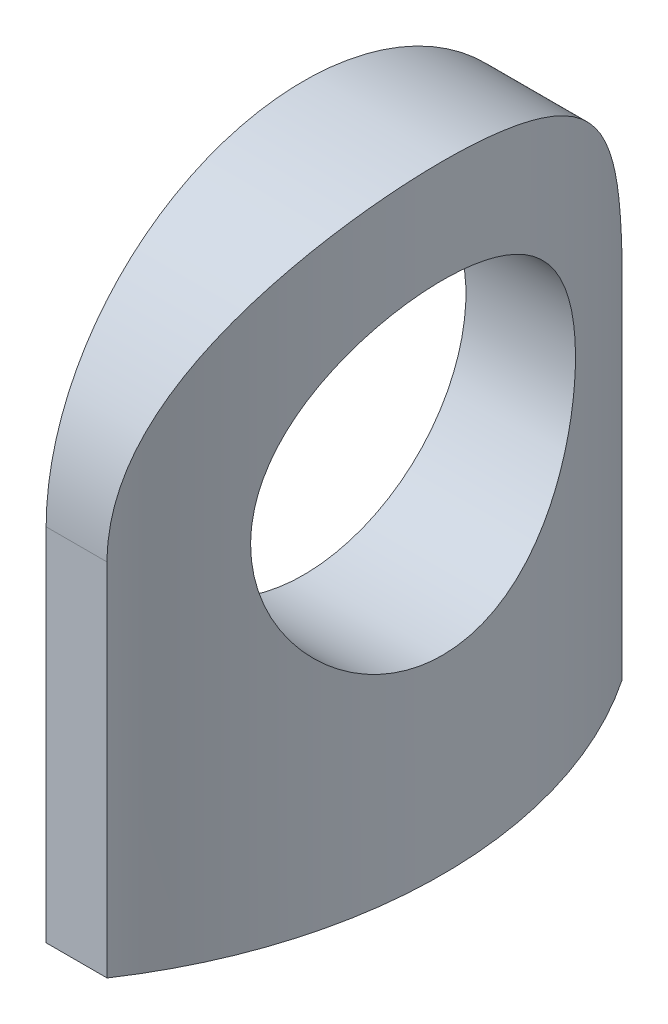
ISO-10303-21;
HEADER;
FILE_DESCRIPTION(('STEP AP214'),'2;1');
FILE_NAME('part.step','',(''),(''),'','','');
FILE_SCHEMA(('AUTOMOTIVE_DESIGN { 1 0 10303 214 1 1 1 1 }'));
ENDSEC;
DATA;
#1=APPLICATION_CONTEXT('core data for automotive mechanical design processes');
#2=APPLICATION_PROTOCOL_DEFINITION('international standard','automotive_design',2000,#1);
#3=PRODUCT_CONTEXT('',#1,'mechanical');
#4=PRODUCT('Part','Part','',(#3));
#5=PRODUCT_RELATED_PRODUCT_CATEGORY('part','',(#4));
#6=PRODUCT_DEFINITION_FORMATION('','',#4);
#7=PRODUCT_DEFINITION_CONTEXT('part definition',#1,'design');
#8=PRODUCT_DEFINITION('design','',#6,#7);
#9=PRODUCT_DEFINITION_SHAPE('','',#8);
#10=(LENGTH_UNIT() NAMED_UNIT(*) SI_UNIT(.MILLI.,.METRE.));
#11=(NAMED_UNIT(*) PLANE_ANGLE_UNIT() SI_UNIT($,.RADIAN.));
#12=(NAMED_UNIT(*) SI_UNIT($,.STERADIAN.) SOLID_ANGLE_UNIT());
#13=UNCERTAINTY_MEASURE_WITH_UNIT(LENGTH_MEASURE(1.E-05),#10,'distance_accuracy_value','');
#14=(GEOMETRIC_REPRESENTATION_CONTEXT(3) GLOBAL_UNCERTAINTY_ASSIGNED_CONTEXT((#13)) GLOBAL_UNIT_ASSIGNED_CONTEXT((#10,
#11,#12)) REPRESENTATION_CONTEXT('',''));
#15=CARTESIAN_POINT('',(0.,0.,0.));
#16=DIRECTION('',(0.,0.,1.));
#17=DIRECTION('',(1.,0.,0.));
#18=AXIS2_PLACEMENT_3D('',#15,#16,#17);
#19=CARTESIAN_POINT('',(20.0025,12.7,-31.75));
#20=DIRECTION('',(1.,0.,0.));
#21=DIRECTION('',(0.,1.,0.));
#22=AXIS2_PLACEMENT_3D('',#19,#20,#21);
#23=PLANE('',#22);
#24=DIRECTION('',(0.,1.,0.));
#25=VECTOR('',#24,1.);
#26=CARTESIAN_POINT('',(20.0025,31.75,-15.875));
#27=LINE('',#26,#25);
#28=CARTESIAN_POINT('',(20.0025,25.4,-15.875));
#29=VERTEX_POINT('',#28);
#30=CARTESIAN_POINT('',(20.0025001,47.625,-15.875));
#31=VERTEX_POINT('',#30);
#32=EDGE_CURVE('E60',#29,#31,#27,.T.);
#33=ORIENTED_EDGE('',*,*,#32,.F.);
#34=DIRECTION('',(0.,0.,-1.));
#35=VECTOR('',#34,1.);
#36=CARTESIAN_POINT('',(20.0025,25.4,0.));
#37=LINE('',#36,#35);
#38=CARTESIAN_POINT('',(20.0025,25.4,15.875));
#39=VERTEX_POINT('',#38);
#40=EDGE_CURVE('E11',#39,#29,#37,.T.);
#41=ORIENTED_EDGE('',*,*,#40,.F.);
#42=DIRECTION('',(0.,1.,0.));
#43=VECTOR('',#42,1.);
#44=CARTESIAN_POINT('',(20.0025,31.75,15.875));
#45=LINE('',#44,#43);
#46=CARTESIAN_POINT('',(20.0025,47.6250000015875,15.875));
#47=VERTEX_POINT('',#46);
#48=EDGE_CURVE('E88',#39,#47,#45,.T.);
#49=ORIENTED_EDGE('',*,*,#48,.T.);
#50=CARTESIAN_POINT('',(20.0025,47.625,0.));
#51=DIRECTION('',(1.,0.,0.));
#52=DIRECTION('',(0.,0.,-1.));
#53=AXIS2_PLACEMENT_3D('',#50,#51,#52);
#54=CIRCLE('',#53,15.875);
#55=EDGE_CURVE('E154',#31,#47,#54,.T.);
#56=ORIENTED_EDGE('',*,*,#55,.F.);
#57=EDGE_LOOP('',(#33,#41,#49,#56));
#58=FACE_BOUND('',#57,.T.);
#59=CARTESIAN_POINT('',(20.0025,47.1297,0.));
#60=DIRECTION('',(-1.,0.,0.));
#61=DIRECTION('',(0.,0.,1.));
#62=AXIS2_PLACEMENT_3D('',#59,#60,#61);
#63=CIRCLE('',#62,10.0203);
#64=CARTESIAN_POINT('',(20.0025,47.1297,10.0203));
#65=VERTEX_POINT('',#64);
#66=EDGE_CURVE('E184',#65,#65,#63,.T.);
#67=ORIENTED_EDGE('',*,*,#66,.F.);
#68=EDGE_LOOP('',(#67));
#69=FACE_BOUND('',#68,.T.);
#70=ADVANCED_FACE('F43',(#58,#69),#23,.F.);
#71=CARTESIAN_POINT('',(-103.07574,47.625,0.));
#72=DIRECTION('',(1.,0.,0.));
#73=DIRECTION('',(0.,1.,0.));
#74=AXIS2_PLACEMENT_3D('',#71,#72,#73);
#75=CYLINDRICAL_SURFACE('',#74,15.875);
#76=CARTESIAN_POINT('',(28.575,63.5,0.));
#77=CARTESIAN_POINT('',(28.575002626647,63.5000013550789,0.206608866897238));
#78=CARTESIAN_POINT('',(28.5727584775999,63.4959656930392,0.413189463176419));
#79=CARTESIAN_POINT('',(28.5638067234789,63.4798452969933,0.82592999213907));
#80=CARTESIAN_POINT('',(28.5570993263651,63.4677609380075,1.03208994397311));
#81=CARTESIAN_POINT('',(28.5303393107039,63.4194937395245,1.64913971318309));
#82=CARTESIAN_POINT('',(28.5036487851183,63.3712967049631,2.0588834252847));
#83=CARTESIAN_POINT('',(28.4334271695705,63.2438211581274,2.86979641598518));
#84=CARTESIAN_POINT('',(28.3899830263132,63.164703089536,3.27099886046867));
#85=CARTESIAN_POINT('',(28.2873215678301,62.9763450644619,4.06423419296298));
#86=CARTESIAN_POINT('',(28.2281030880267,62.8671028839748,4.45626640163406));
#87=CARTESIAN_POINT('',(28.0954078741234,62.6199255274337,5.22797921454727));
#88=CARTESIAN_POINT('',(28.0219533295744,62.4820349814026,5.60767798103191));
#89=CARTESIAN_POINT('',(27.8623845092588,62.1788340244862,6.35322851986153));
#90=CARTESIAN_POINT('',(27.7762690216698,62.0135209887056,6.71907896251629));
#91=CARTESIAN_POINT('',(27.5931552641565,61.6567736219933,7.43540281562206));
#92=CARTESIAN_POINT('',(27.4961468230338,61.4653148410445,7.78586142221105));
#93=CARTESIAN_POINT('',(27.2933159070587,61.0578446065158,8.46951534210945));
#94=CARTESIAN_POINT('',(27.1874930597863,60.841832115369,8.80270992502571));
#95=CARTESIAN_POINT('',(26.9616260639239,60.3709738186348,9.4728461547712));
#96=CARTESIAN_POINT('',(26.8411043976972,60.1144787151367,9.80846822096996));
#97=CARTESIAN_POINT('',(26.5950375004005,59.5764963260797,10.4572969776648));
#98=CARTESIAN_POINT('',(26.4694901946195,59.294998659145,10.7704942587071));
#99=CARTESIAN_POINT('',(26.216100128547,58.7082742425436,11.3733778590713));
#100=CARTESIAN_POINT('',(26.0882555052157,58.4030274973727,11.6630439376294));
#101=CARTESIAN_POINT('',(25.8332967143976,57.7703466305158,12.2173856043466));
#102=CARTESIAN_POINT('',(25.7061825850494,57.4429113615954,12.4820598986357));
#103=CARTESIAN_POINT('',(25.4429117185561,56.7324913790674,13.010948345499));
#104=CARTESIAN_POINT('',(25.3071580097955,56.3472491829896,13.2723526138569));
#105=CARTESIAN_POINT('',(25.1102341513862,55.751742884574,13.6391368140879));
#106=CARTESIAN_POINT('',(25.0457058112787,55.5502836535871,13.7571861816917));
#107=CARTESIAN_POINT('',(24.9193987408874,55.1415968316861,13.9846743739953));
#108=CARTESIAN_POINT('',(24.8576212189792,54.934366769487,14.0941094305071));
#109=CARTESIAN_POINT('',(24.6776342013071,54.3056818680676,14.4084421668155));
#110=CARTESIAN_POINT('',(24.564375473467,53.8760554446508,14.6000933717377));
#111=CARTESIAN_POINT('',(24.3557048417045,52.9978104381176,14.9456041491806));
#112=CARTESIAN_POINT('',(24.260287206609,52.5491980109445,15.099475862765));
#113=CARTESIAN_POINT('',(24.1098480437756,51.7351477981218,15.3382262428381));
#114=CARTESIAN_POINT('',(24.0505533976883,51.3727537879511,15.4308300862995));
#115=CARTESIAN_POINT('',(23.9473529191105,50.6403084339474,15.5905091724757));
#116=CARTESIAN_POINT('',(23.9034427307928,50.2702592890013,15.6575916415625));
#117=CARTESIAN_POINT('',(23.8322591089723,49.5225628878812,15.7657320284054));
#118=CARTESIAN_POINT('',(23.8050814477847,49.1448844410849,15.8066401830387));
#119=CARTESIAN_POINT('',(23.7778006541761,48.576200967285,15.8476197917743));
#120=CARTESIAN_POINT('',(23.7709546288817,48.3861858945141,15.8578825825827));
#121=CARTESIAN_POINT('',(23.7618141305394,48.005788681296,15.8715736697468));
#122=CARTESIAN_POINT('',(23.7595199426243,47.8154065186016,15.8750015379543));
#123=CARTESIAN_POINT('',(23.7595244060145,47.6250000512827,15.875));
#124=B_SPLINE_CURVE_WITH_KNOTS('',3,(#76,#77,#78,#79,#80,#81,#82,#83,#84,#85,#86,#87,#88,#89,
#90,#91,#92,#93,#94,#95,#96,#97,#98,#99,#100,#101,#102,#103,#104,#105,#106,#107,#108,#109,#110,
#111,#112,#113,#114,#115,#116,#117,#118,#119,#120,#121,#122,#123),.UNSPECIFIED.,.F.,.F.,(4,2,2,
2,2,2,2,2,2,2,2,2,2,2,2,2,2,2,2,2,2,2,2,4),(0.,0.619718984513591,1.23940909591682,
2.47794043424568,3.710128803065,4.94240816631178,6.17278202027725,7.40327371430886,
8.63492407620783,9.86662650335497,11.1830765538908,12.5000757892257,13.8181961259973,
15.1363846668763,16.589252860282,17.315801887972,18.0426669864992,19.4920987772133,
20.9410641575985,22.0760207851448,23.2106558103473,24.3517262193265,24.9228172310223,
25.4939440154544),.UNSPECIFIED.);
#125=CARTESIAN_POINT('',(28.575,63.4999999166364,0.));
#126=VERTEX_POINT('',#125);
#127=CARTESIAN_POINT('',(23.7595244073544,47.6250000510915,15.87499999802));
#128=VERTEX_POINT('',#127);
#129=EDGE_CURVE('E108',#126,#128,#124,.T.);
#130=ORIENTED_EDGE('',*,*,#129,.F.);
#131=CARTESIAN_POINT('',(28.575,63.5,0.));
#132=CARTESIAN_POINT('',(28.5735892823362,63.4999998247561,-0.128769740949089));
#133=CARTESIAN_POINT('',(28.5718501579519,63.4984330671729,-0.257527909497629));
#134=CARTESIAN_POINT('',(28.5677225545907,63.4924434755048,-0.503644604278612));
#135=CARTESIAN_POINT('',(28.5654045556859,63.4882836799331,-0.621010736797138));
#136=CARTESIAN_POINT('',(28.5579864740723,63.4734763402549,-0.939033358133707));
#137=CARTESIAN_POINT('',(28.5520801904402,63.4603188003046,-1.13956791719391));
#138=CARTESIAN_POINT('',(28.5399020058571,63.4363293595198,-1.42283586574148));
#139=CARTESIAN_POINT('',(28.5358599468876,63.4286302410845,-1.50594039538025));
#140=CARTESIAN_POINT('',(28.5256238783954,63.4098394374103,-1.69273422859841));
#141=CARTESIAN_POINT('',(28.5191444804798,63.398380909255,-1.79637094013196));
#142=CARTESIAN_POINT('',(28.497974612956,63.3606556362435,-2.10933061135925));
#143=CARTESIAN_POINT('',(28.4816716012573,63.3312429041902,-2.31817469142547));
#144=CARTESIAN_POINT('',(28.444358141253,63.263645560175,-2.73756257981999));
#145=CARTESIAN_POINT('',(28.4232746589601,63.2253245944351,-2.94807782466833));
#146=CARTESIAN_POINT('',(28.377808725468,63.1423080967939,-3.35712128541731));
#147=CARTESIAN_POINT('',(28.3536267975431,63.0979947391165,-3.55574948320132));
#148=CARTESIAN_POINT('',(28.3008366123261,63.0010497326542,-3.9541751710802));
#149=CARTESIAN_POINT('',(28.2721573042778,62.9482842024121,-4.15393066708671));
#150=CARTESIAN_POINT('',(28.2104241852366,62.8341658869697,-4.55422671762106));
#151=CARTESIAN_POINT('',(28.1773014811763,62.7726767394628,-4.75471774094067));
#152=CARTESIAN_POINT('',(28.1066630754937,62.6408583641048,-5.15606750035691));
#153=CARTESIAN_POINT('',(28.0690794731443,62.5703908511809,-5.35686883589486));
#154=CARTESIAN_POINT('',(27.9895330334089,62.420376373534,-5.75840350426275));
#155=CARTESIAN_POINT('',(27.9475039520765,62.3406896859855,-5.95907152521705));
#156=CARTESIAN_POINT('',(27.8641375086061,62.1817778826129,-6.33668363309105));
#157=CARTESIAN_POINT('',(27.823142259833,62.1032854035055,-6.51401243645553));
#158=CARTESIAN_POINT('',(27.7369341615497,61.9371694120216,-6.87151185710941));
#159=CARTESIAN_POINT('',(27.6916223360769,61.8493181589873,-7.05155280412374));
#160=CARTESIAN_POINT('',(27.5967883244044,61.6639590194373,-7.41391339810433));
#161=CARTESIAN_POINT('',(27.5471741425547,61.566220294531,-7.59609084595175));
#162=CARTESIAN_POINT('',(27.4437137823625,61.3605790005531,-7.96210090477917));
#163=CARTESIAN_POINT('',(27.3897809814159,61.2524434819795,-8.1457780760082));
#164=CARTESIAN_POINT('',(27.2777272578745,61.0255078792624,-8.51412571480991));
#165=CARTESIAN_POINT('',(27.2195267854333,60.9064732022656,-8.69862759851202));
#166=CARTESIAN_POINT('',(27.1142804823296,60.6893700103038,-9.02033300795738));
#167=CARTESIAN_POINT('',(27.0677363090891,60.5927511545684,-9.15868284067226));
#168=CARTESIAN_POINT('',(26.9684166054976,60.3847705062651,-9.44662433764498));
#169=CARTESIAN_POINT('',(26.9155079950026,60.2729386680588,-9.59583102004522));
#170=CARTESIAN_POINT('',(26.8034626012445,60.0332079979239,-9.90422898455003));
#171=CARTESIAN_POINT('',(26.7442189845546,59.9048021719421,-10.0629873213314));
#172=CARTESIAN_POINT('',(26.6195087101026,59.6305453587293,-10.3890228119711));
#173=CARTESIAN_POINT('',(26.5539546598758,59.4841553596099,-10.5558134995153));
#174=CARTESIAN_POINT('',(26.4164568094598,59.1725766163785,-10.8961730159494));
#175=CARTESIAN_POINT('',(26.3444263531233,59.0068265867712,-11.069192673241));
#176=CARTESIAN_POINT('',(26.1803143039057,58.6214071693342,-11.4537162352839));
#177=CARTESIAN_POINT('',(26.0881307697202,58.3993779288473,-11.6628207265424));
#178=CARTESIAN_POINT('',(25.9194791662034,57.9814563000252,-12.0342870397028));
#179=CARTESIAN_POINT('',(25.8429461013968,57.7873548103426,-12.1986406313676));
#180=CARTESIAN_POINT('',(25.7053862325346,57.4308972501105,-12.4860505521845));
#181=CARTESIAN_POINT('',(25.6443105297677,57.2699288932854,-12.6108066885494));
#182=CARTESIAN_POINT('',(25.5376582765414,56.9839241251194,-12.8237886812761));
#183=CARTESIAN_POINT('',(25.4920105228912,56.8599248051999,-12.9133732877126));
#184=CARTESIAN_POINT('',(25.4164320814337,56.6508078964629,-13.0598959600628));
#185=CARTESIAN_POINT('',(25.3863108761125,56.5664375717356,-13.1178055302696));
#186=CARTESIAN_POINT('',(25.2902140583383,56.2926694091187,-13.3018358947352));
#187=CARTESIAN_POINT('',(25.2253646603412,56.1008117457831,-13.4249115101363));
#188=CARTESIAN_POINT('',(25.1008497643881,55.7215314434107,-13.6568180237276));
#189=CARTESIAN_POINT('',(25.0410891851613,55.5343881537584,-13.7660559841435));
#190=CARTESIAN_POINT('',(24.9271076012895,55.1654746820767,-13.9713623924302));
#191=CARTESIAN_POINT('',(24.8727618331041,54.9839618618573,-14.0678236206212));
#192=CARTESIAN_POINT('',(24.7695197294551,54.6272439275388,-14.248574552264));
#193=CARTESIAN_POINT('',(24.7204894197895,54.4522704290596,-14.3332447449764));
#194=CARTESIAN_POINT('',(24.6279822587879,54.109407862052,-14.4914297483948));
#195=CARTESIAN_POINT('',(24.5843488508659,53.941729296842,-14.5653094584836));
#196=CARTESIAN_POINT('',(24.491180010804,53.5692481416681,-14.7217575996833));
#197=CARTESIAN_POINT('',(24.4422269091398,53.3637731194981,-14.8030771728745));
#198=CARTESIAN_POINT('',(24.3496453146162,52.9551849286634,-14.9549589399451));
#199=CARTESIAN_POINT('',(24.3058996065091,52.7521924130484,-15.0257744630886));
#200=CARTESIAN_POINT('',(24.2238015554129,52.3491400053287,-15.1572306084439));
#201=CARTESIAN_POINT('',(24.1853232757102,52.1491871241858,-15.2181202880413));
#202=CARTESIAN_POINT('',(24.1137885664219,51.7527448618629,-15.3303104043346));
#203=CARTESIAN_POINT('',(24.080598241497,51.5563487644854,-15.3818549570677));
#204=CARTESIAN_POINT('',(24.0195090513487,51.1675154283808,-15.4759462841767));
#205=CARTESIAN_POINT('',(23.9914730793228,50.9751575097324,-15.5187313877719));
#206=CARTESIAN_POINT('',(23.9386349141791,50.575295910058,-15.5998637424159));
#207=CARTESIAN_POINT('',(23.9141782677697,50.3676455932926,-15.6377171860432));
#208=CARTESIAN_POINT('',(23.8715896393769,49.9506534591107,-15.7051423648668));
#209=CARTESIAN_POINT('',(23.853448860342,49.7413144133229,-15.7347256077903));
#210=CARTESIAN_POINT('',(23.8307576785446,49.4262950265656,-15.7728294367357));
#211=CARTESIAN_POINT('',(23.8239482966948,49.3211436403955,-15.7844836414462));
#212=CARTESIAN_POINT('',(23.8136039485196,49.1386143988395,-15.8028674677366));
#213=CARTESIAN_POINT('',(23.8096800180218,49.0613069546945,-15.8100816020466));
#214=CARTESIAN_POINT('',(23.7967429274911,48.7865607919687,-15.8336868651831));
#215=CARTESIAN_POINT('',(23.7892758726911,48.5887708373982,-15.8469570177021));
#216=CARTESIAN_POINT('',(23.7784249402658,48.2704046732545,-15.8623331030442));
#217=CARTESIAN_POINT('',(23.7745877247034,48.1499472765196,-15.8667762007498));
#218=CARTESIAN_POINT('',(23.7669090903444,47.8946710178322,-15.8732818528199));
#219=CARTESIAN_POINT('',(23.7631210516253,47.7598417370965,-15.8749999405965));
#220=CARTESIAN_POINT('',(23.7595244060145,47.625,-15.875));
#221=B_SPLINE_CURVE_WITH_KNOTS('',3,(#131,#132,#133,#134,#135,#136,#137,#138,#139,#140,#141,
#142,#143,#144,#145,#146,#147,#148,#149,#150,#151,#152,#153,#154,#155,#156,#157,#158,#159,#160,
#161,#162,#163,#164,#165,#166,#167,#168,#169,#170,#171,#172,#173,#174,#175,#176,#177,#178,#179,
#180,#181,#182,#183,#184,#185,#186,#187,#188,#189,#190,#191,#192,#193,#194,#195,#196,#197,#198,
#199,#200,#201,#202,#203,#204,#205,#206,#207,#208,#209,#210,#211,#212,#213,#214,#215,#216,#217,
#218,#219,#220),.UNSPECIFIED.,.F.,.F.,(4,2,2,2,2,2,2,2,2,2,2,2,2,2,2,2,2,2,2,2,2,2,2,2,2,2,2,2,
2,2,2,2,2,2,2,2,2,2,2,2,2,2,2,2,4),(0.,0.386305866511155,0.738669760293939,1.34160790577783,
1.59226852227925,1.90565105594172,2.54002735524555,3.18484040562056,3.79948187486606,
4.4250508446455,5.06177615179043,5.70987481261149,6.3695526158665,6.96403771616362,
7.58005299719419,8.21771235599478,8.87711844811189,9.55836407223386,10.0834297293868,
10.6647884690791,11.3024642991101,11.9964748803448,12.7468333890319,13.7021821742158,
14.4987148367232,15.1364153070025,15.6152714753962,15.9352764523125,16.6459949241376,
17.3201625130368,17.9578434050809,18.5591136279919,19.1240640673404,19.8028507540918,
20.4608315676368,21.0982221368762,21.7152597009057,22.3122057890967,22.9494055605144,
23.585714224276,23.9037268480064,24.1369444846688,24.7318856100143,25.0936602204369,
25.4983031321866),.UNSPECIFIED.);
#222=CARTESIAN_POINT('',(23.7595244060145,47.625,-15.875));
#223=VERTEX_POINT('',#222);
#224=EDGE_CURVE('E95',#126,#223,#221,.T.);
#225=ORIENTED_EDGE('',*,*,#224,.T.);
#226=CARTESIAN_POINT('',(23.7595244060145,47.625,-15.875));
#227=DIRECTION('',(-1.,0.,0.));
#228=VECTOR('',#227,1.);
#229=LINE('',#226,#228);
#230=EDGE_CURVE('E159',#223,#31,#229,.T.);
#231=ORIENTED_EDGE('',*,*,#230,.T.);
#232=ORIENTED_EDGE('',*,*,#55,.T.);
#233=CARTESIAN_POINT('',(20.0025,47.625,15.875));
#234=DIRECTION('',(1.,0.,0.));
#235=VECTOR('',#234,1.);
#236=LINE('',#233,#235);
#237=EDGE_CURVE('E91',#47,#128,#236,.T.);
#238=ORIENTED_EDGE('',*,*,#237,.T.);
#239=EDGE_LOOP('',(#130,#225,#231,#232,#238));
#240=FACE_BOUND('',#239,.T.);
#241=ADVANCED_FACE('F45',(#240),#75,.T.);
#242=CARTESIAN_POINT('',(-31.75,25.4,-15.875));
#243=DIRECTION('',(0.,0.,-1.));
#244=DIRECTION('',(0.,1.,0.));
#245=AXIS2_PLACEMENT_3D('',#242,#243,#244);
#246=PLANE('',#245);
#247=DIRECTION('',(1.,0.,0.));
#248=VECTOR('',#247,1.);
#249=CARTESIAN_POINT('',(0.,25.4,-15.875));
#250=LINE('',#249,#248);
#251=CARTESIAN_POINT('',(23.7595244060145,25.4,-15.875));
#252=VERTEX_POINT('',#251);
#253=EDGE_CURVE('E114',#29,#252,#250,.T.);
#254=ORIENTED_EDGE('',*,*,#253,.F.);
#255=ORIENTED_EDGE('',*,*,#32,.T.);
#256=ORIENTED_EDGE('',*,*,#230,.F.);
#257=DIRECTION('',(0.,1.,0.));
#258=VECTOR('',#257,1.);
#259=CARTESIAN_POINT('',(23.7595244060145,0.,-15.875));
#260=LINE('',#259,#258);
#261=EDGE_CURVE('E110',#223,#252,#260,.F.);
#262=ORIENTED_EDGE('',*,*,#261,.T.);
#263=EDGE_LOOP('',(#254,#255,#256,#262));
#264=FACE_BOUND('',#263,.T.);
#265=ADVANCED_FACE('F138',(#264),#246,.T.);
#266=CARTESIAN_POINT('',(-31.75,25.4,15.875));
#267=DIRECTION('',(0.,0.,-1.));
#268=DIRECTION('',(0.,1.,0.));
#269=AXIS2_PLACEMENT_3D('',#266,#267,#268);
#270=PLANE('',#269);
#271=ORIENTED_EDGE('',*,*,#48,.F.);
#272=DIRECTION('',(1.,0.,0.));
#273=VECTOR('',#272,1.);
#274=CARTESIAN_POINT('',(-31.75,25.4,15.875));
#275=LINE('',#274,#273);
#276=CARTESIAN_POINT('',(23.7595244060145,25.4,15.875));
#277=VERTEX_POINT('',#276);
#278=EDGE_CURVE('E68',#39,#277,#275,.T.);
#279=ORIENTED_EDGE('',*,*,#278,.T.);
#280=DIRECTION('',(0.,1.,0.));
#281=VECTOR('',#280,1.);
#282=CARTESIAN_POINT('',(23.7595244060145,25.4,15.875));
#283=LINE('',#282,#281);
#284=EDGE_CURVE('E104',#277,#128,#283,.T.);
#285=ORIENTED_EDGE('',*,*,#284,.T.);
#286=ORIENTED_EDGE('',*,*,#237,.F.);
#287=EDGE_LOOP('',(#271,#279,#285,#286));
#288=FACE_BOUND('',#287,.T.);
#289=ADVANCED_FACE('F89',(#288),#270,.F.);
#290=CARTESIAN_POINT('',(0.,0.,0.));
#291=DIRECTION('',(0.,1.,0.));
#292=DIRECTION('',(1.,0.,0.));
#293=AXIS2_PLACEMENT_3D('',#290,#291,#292);
#294=CYLINDRICAL_SURFACE('',#293,28.575);
#295=CARTESIAN_POINT('',(0.,25.4,0.));
#296=DIRECTION('',(0.,1.,0.));
#297=DIRECTION('',(0.,0.,1.));
#298=AXIS2_PLACEMENT_3D('',#295,#296,#297);
#299=CIRCLE('',#298,28.575);
#300=EDGE_CURVE('E53',#252,#277,#299,.F.);
#301=ORIENTED_EDGE('',*,*,#300,.F.);
#302=ORIENTED_EDGE('',*,*,#261,.F.);
#303=ORIENTED_EDGE('',*,*,#224,.F.);
#304=ORIENTED_EDGE('',*,*,#129,.T.);
#305=ORIENTED_EDGE('',*,*,#284,.F.);
#306=EDGE_LOOP('',(#301,#302,#303,#304,#305));
#307=FACE_BOUND('',#306,.T.);
#308=CARTESIAN_POINT('',(28.575,37.1094,0.));
#309=CARTESIAN_POINT('',(28.5750003769053,37.1093994629821,-0.272542580301307));
#310=CARTESIAN_POINT('',(28.5710921026778,37.1205280864616,-0.545077232973781));
#311=CARTESIAN_POINT('',(28.5555672786092,37.1649298783396,-1.08810614157751));
#312=CARTESIAN_POINT('',(28.543951027361,37.1982021889324,-1.35860047613644));
#313=CARTESIAN_POINT('',(28.5133263736555,37.2865662656559,-1.89556540860215));
#314=CARTESIAN_POINT('',(28.4943180967233,37.3416576612742,-2.16203607475552));
#315=CARTESIAN_POINT('',(28.4494194083427,37.4731443895366,-2.68907296900862));
#316=CARTESIAN_POINT('',(28.4235288955786,37.5495400358085,-2.9496391101246));
#317=CARTESIAN_POINT('',(28.3656071016424,37.7227823660399,-3.46257836307414));
#318=CARTESIAN_POINT('',(28.3335882913714,37.81958755713,-3.71496691690442));
#319=CARTESIAN_POINT('',(28.2641878986499,38.0329816995733,-4.21057598944201));
#320=CARTESIAN_POINT('',(28.226804330537,38.1495779791528,-4.45379307122661));
#321=CARTESIAN_POINT('',(28.1476288851639,38.4016355320699,-4.92947819425555));
#322=CARTESIAN_POINT('',(28.1058371521325,38.537096188239,-5.1619465868236));
#323=CARTESIAN_POINT('',(28.0188805190509,38.8259408295346,-5.61481388809595));
#324=CARTESIAN_POINT('',(27.973715403817,38.9793259583925,-5.83521202529772));
#325=CARTESIAN_POINT('',(27.8795438131527,39.3085449605563,-6.26999308069989));
#326=CARTESIAN_POINT('',(27.8304588635998,39.4849660127428,-6.48391453827706));
#327=CARTESIAN_POINT('',(27.7311569276317,39.8547725403171,-6.89627046301699));
#328=CARTESIAN_POINT('',(27.6809399208312,40.0481583213749,-7.09470465100869));
#329=CARTESIAN_POINT('',(27.5806869585863,40.4507709848144,-7.47495885402908));
#330=CARTESIAN_POINT('',(27.5306510534197,40.6600019583558,-7.65677455130902));
#331=CARTESIAN_POINT('',(27.4321207341675,41.0930224304097,-8.00260658048228));
#332=CARTESIAN_POINT('',(27.383626281544,41.316811564527,-8.16662335761423));
#333=CARTESIAN_POINT('',(27.2879761772424,41.7851999756928,-8.48085132228964));
#334=CARTESIAN_POINT('',(27.2409163549299,42.0302407166148,-8.63043461999242));
#335=CARTESIAN_POINT('',(27.1513282875395,42.532797820532,-8.90827179629807));
#336=CARTESIAN_POINT('',(27.1087982444624,42.790309174097,-9.03653414921575));
#337=CARTESIAN_POINT('',(27.0296085940403,43.3161623107423,-9.27071591701391));
#338=CARTESIAN_POINT('',(26.9929486628891,43.5845034954061,-9.37663656440606));
#339=CARTESIAN_POINT('',(26.9267240361208,44.1301083241939,-9.56515310908849));
#340=CARTESIAN_POINT('',(26.8971589827597,44.4073715176449,-9.647750182457));
#341=CARTESIAN_POINT('',(26.8470905991548,44.9583982479603,-9.78619291309816));
#342=CARTESIAN_POINT('',(26.8262943558777,45.2319163665588,-9.84290960452032));
#343=CARTESIAN_POINT('',(26.7929377229637,45.783227620046,-9.93335018543852));
#344=CARTESIAN_POINT('',(26.7803771457846,46.0610206574391,-9.96707459851405));
#345=CARTESIAN_POINT('',(26.7639266511237,46.6186270001009,-10.011164335457));
#346=CARTESIAN_POINT('',(26.7600341212133,46.8984396711669,-10.0215366973172));
#347=CARTESIAN_POINT('',(26.7610482194471,47.4579307584588,-10.0188286959631));
#348=CARTESIAN_POINT('',(26.7659545636023,47.7376091787263,-10.0057490896747));
#349=CARTESIAN_POINT('',(26.7839189945324,48.2802867179273,-9.95755588423567));
#350=CARTESIAN_POINT('',(26.7965454644124,48.5434047345036,-9.92360845622233));
#351=CARTESIAN_POINT('',(26.8291680952328,49.0656673596366,-9.83506926325034));
#352=CARTESIAN_POINT('',(26.8491639662562,49.3248121240858,-9.78047831041858));
#353=CARTESIAN_POINT('',(26.8959206769241,49.8373699086805,-9.65115509233154));
#354=CARTESIAN_POINT('',(26.9226809435909,50.0907834123123,-9.57642453296507));
#355=CARTESIAN_POINT('',(26.9821977519606,50.5903839106785,-9.40742525633425));
#356=CARTESIAN_POINT('',(27.0149565776802,50.8365681112046,-9.31314909505522));
#357=CARTESIAN_POINT('',(27.0861424111536,51.3242290339947,-9.10406001452648));
#358=CARTESIAN_POINT('',(27.1246559555825,51.5655555995388,-8.9889265673963));
#359=CARTESIAN_POINT('',(27.2058685398715,52.0377750679876,-8.74004994147304));
#360=CARTESIAN_POINT('',(27.2485690053535,52.2686643776987,-8.60630041746772));
#361=CARTESIAN_POINT('',(27.3370075918407,52.7186581048017,-8.32111307575268));
#362=CARTESIAN_POINT('',(27.382745980513,52.9377614806658,-8.16967369852147));
#363=CARTESIAN_POINT('',(27.4760799209676,53.3629809548201,-7.85005541004414));
#364=CARTESIAN_POINT('',(27.5236755422306,53.5690965664716,-7.68187587216902));
#365=CARTESIAN_POINT('',(27.6223353480655,53.9788621768949,-7.31946057552178));
#366=CARTESIAN_POINT('',(27.6734397449088,54.1816649082743,-7.12427664595856));
#367=CARTESIAN_POINT('',(27.7749784539836,54.5701548038882,-6.7175230655042));
#368=CARTESIAN_POINT('',(27.8254129693718,54.7558472635531,-6.50595852177918));
#369=CARTESIAN_POINT('',(27.9242884150687,55.1090758877896,-6.06755711822144));
#370=CARTESIAN_POINT('',(27.97272834127,55.2766029752955,-5.84071271413099));
#371=CARTESIAN_POINT('',(28.0662571283072,55.5921630817243,-5.37332347084147));
#372=CARTESIAN_POINT('',(28.1113473167709,55.7402038419652,-5.13278412695607));
#373=CARTESIAN_POINT('',(28.1974928457197,56.0174426866073,-4.63640359040143));
#374=CARTESIAN_POINT('',(28.2384918925899,56.1463872940258,-4.38041086238284));
#375=CARTESIAN_POINT('',(28.3146515178034,56.3821445396574,-3.85757860127942));
#376=CARTESIAN_POINT('',(28.3498120090002,56.4889568475292,-3.59073890636648));
#377=CARTESIAN_POINT('',(28.4132639331723,56.6794341005349,-3.04821505536707));
#378=CARTESIAN_POINT('',(28.4415575149081,56.7631062877112,-2.77253369662124));
#379=CARTESIAN_POINT('',(28.4904502612479,56.9065141588257,-2.21434815259443));
#380=CARTESIAN_POINT('',(28.5110498221685,56.9662510756735,-1.93184431953521));
#381=CARTESIAN_POINT('',(28.5431555920924,57.0589150075354,-1.3757720535719));
#382=CARTESIAN_POINT('',(28.5550465345313,57.0929785702066,-1.10241477808029));
#383=CARTESIAN_POINT('',(28.5709556187576,57.1384836762738,-0.553597897949884));
#384=CARTESIAN_POINT('',(28.5749740095536,57.1499259351814,-0.278138360082289));
#385=CARTESIAN_POINT('',(28.5750257354493,57.1500733376492,0.272739559537237));
#386=CARTESIAN_POINT('',(28.5710604119081,57.1387823006742,0.548157940428933));
#387=CARTESIAN_POINT('',(28.5552582046047,57.0935851061814,1.09690173166425));
#388=CARTESIAN_POINT('',(28.5434214155337,57.059679220713,1.37022716714533));
#389=CARTESIAN_POINT('',(28.5127208840487,56.9710769540725,1.90379251683556));
#390=CARTESIAN_POINT('',(28.494101510327,56.9171023705305,2.16416686189257));
#391=CARTESIAN_POINT('',(28.450280136372,56.788781874273,2.67937511538178));
#392=CARTESIAN_POINT('',(28.425075802192,56.714428738207,2.9342070246153));
#393=CARTESIAN_POINT('',(28.3687309700711,56.5460142862866,3.43650819020407));
#394=CARTESIAN_POINT('',(28.3375921586566,56.4519585689815,3.6839795153286));
#395=CARTESIAN_POINT('',(28.2701306101412,56.2448334761559,4.17020554409905));
#396=CARTESIAN_POINT('',(28.2338058765973,56.1317567750571,4.40895684610628));
#397=CARTESIAN_POINT('',(28.1558108415313,55.8841077338089,4.88263442269372));
#398=CARTESIAN_POINT('',(28.1140216803512,55.7490328462472,5.11727834453038));
#399=CARTESIAN_POINT('',(28.0269438424245,55.4606225555924,5.57451711701523));
#400=CARTESIAN_POINT('',(27.9816536097006,55.3072790168086,5.79710653468963));
#401=CARTESIAN_POINT('',(27.8887147655709,54.9833782870131,6.22888355430687));
#402=CARTESIAN_POINT('',(27.8410659942597,54.8128199280456,6.43807024535291));
#403=CARTESIAN_POINT('',(27.7445956391725,54.4555416477202,6.84186653075906));
#404=CARTESIAN_POINT('',(27.6957740199598,54.2688212375922,7.03647568393543));
#405=CARTESIAN_POINT('',(27.595698013514,53.8704245217012,7.41951673647884));
#406=CARTESIAN_POINT('',(27.5444460044684,53.6579623814628,7.60713290496283));
#407=CARTESIAN_POINT('',(27.4434511282913,53.2177754172808,7.96379092493729));
#408=CARTESIAN_POINT('',(27.3937077333368,52.9900560230512,8.13283932834326));
#409=CARTESIAN_POINT('',(27.2971218706936,52.520565738846,8.4513596947611));
#410=CARTESIAN_POINT('',(27.2502807529955,52.2787884097016,8.60082258310179));
#411=CARTESIAN_POINT('',(27.1609456983712,51.782892565556,8.87890670712165));
#412=CARTESIAN_POINT('',(27.1184499372689,51.528779295789,9.00753670177925));
#413=CARTESIAN_POINT('',(27.0390945386307,51.00967693155,9.24302154591905));
#414=CARTESIAN_POINT('',(27.0022370707784,50.7446836998409,9.34986801807363));
#415=CARTESIAN_POINT('',(26.9353826693593,50.2057529604115,9.54075602590967));
#416=CARTESIAN_POINT('',(26.9053857725306,49.9318154048036,9.62479743947087));
#417=CARTESIAN_POINT('',(26.8532879771732,49.3771540533667,9.76920928077558));
#418=CARTESIAN_POINT('',(26.8311836712477,49.0964332420335,9.82958992446872));
#419=CARTESIAN_POINT('',(26.7956368309458,48.5303137145443,9.92608325655763));
#420=CARTESIAN_POINT('',(26.7821937953003,48.2449152700857,9.96219734937969));
#421=CARTESIAN_POINT('',(26.7649575441777,47.6880516324313,10.0084082195126));
#422=CARTESIAN_POINT('',(26.7606603873763,47.4167139811626,10.0198641146324));
#423=CARTESIAN_POINT('',(26.7603432704955,46.8740053741388,10.020711412496));
#424=CARTESIAN_POINT('',(26.7643229828894,46.6026344201264,10.0101036883266));
#425=CARTESIAN_POINT('',(26.7804284544037,46.0619129720887,9.96693546964691));
#426=CARTESIAN_POINT('',(26.7925536184635,45.7925623319239,9.93437657876387));
#427=CARTESIAN_POINT('',(26.8245568505652,45.2578372938935,9.84763456668123));
#428=CARTESIAN_POINT('',(26.8444349334042,44.9924629036179,9.79345140420985));
#429=CARTESIAN_POINT('',(26.8907622718652,44.4737540172436,9.66550757417425));
#430=CARTESIAN_POINT('',(26.9170456969576,44.2202831623145,9.59223816902427));
#431=CARTESIAN_POINT('',(26.9756483494417,43.7204445133786,9.42617470976873));
#432=CARTESIAN_POINT('',(27.0079697079921,43.4740792629307,9.33337376030866));
#433=CARTESIAN_POINT('',(27.0777343405746,42.990031734224,9.1289965567445));
#434=CARTESIAN_POINT('',(27.1151774784441,42.7523492253471,9.01742080175089));
#435=CARTESIAN_POINT('',(27.1941805960726,42.2869898843813,8.77628947859422));
#436=CARTESIAN_POINT('',(27.2357408752064,42.0593137816415,8.6467326026716));
#437=CARTESIAN_POINT('',(27.3239440168734,41.6046876558004,8.36395023854648));
#438=CARTESIAN_POINT('',(27.3707343559195,41.3782823756111,8.20989455799548));
#439=CARTESIAN_POINT('',(27.4663745720854,40.9391050661541,7.88401685033749));
#440=CARTESIAN_POINT('',(27.5152245013331,40.7263333822949,7.71219437339478));
#441=CARTESIAN_POINT('',(27.6137050765388,40.315577265792,7.35178994672647));
#442=CARTESIAN_POINT('',(27.663335937204,40.1175969890015,7.16320331922615));
#443=CARTESIAN_POINT('',(27.7620789770202,39.7376450428857,6.77042081771733));
#444=CARTESIAN_POINT('',(27.8111911610074,39.5556732241803,6.56622508939561));
#445=CARTESIAN_POINT('',(27.9098210967133,39.2010040258162,6.13382953771634));
#446=CARTESIAN_POINT('',(27.9592570095777,39.0290965572874,5.90496214018851));
#447=CARTESIAN_POINT('',(28.0547929571005,38.705263593301,5.43297004989914));
#448=CARTESIAN_POINT('',(28.1008942284799,38.5533306725989,5.18985070396102));
#449=CARTESIAN_POINT('',(28.1884917560724,38.2705273841978,4.6908135202234));
#450=CARTESIAN_POINT('',(28.22998744704,38.1396596009497,4.43489411704458));
#451=CARTESIAN_POINT('',(28.3071811071243,37.9001197531266,3.91202578666745));
#452=CARTESIAN_POINT('',(28.3428792232887,37.7914471255831,3.64507713942677));
#453=CARTESIAN_POINT('',(28.4071348034401,37.5982088102683,3.10462024109784));
#454=CARTESIAN_POINT('',(28.4357562942547,37.5134259184192,2.83119734345441));
#455=CARTESIAN_POINT('',(28.4854547021083,37.3674444765692,2.27744618567514));
#456=CARTESIAN_POINT('',(28.5065316255264,37.3062459066272,1.99711793137818));
#457=CARTESIAN_POINT('',(28.5405079745063,37.2080819124733,1.43184298183865));
#458=CARTESIAN_POINT('',(28.5534098349442,37.1711092726527,1.14689768769989));
#459=CARTESIAN_POINT('',(28.5706554598541,37.1217691433593,0.574631921962533));
#460=CARTESIAN_POINT('',(28.5749996026704,37.1094005661188,0.287311555931954));
#461=CARTESIAN_POINT('',(28.575,37.1094,0.));
#462=B_SPLINE_CURVE_WITH_KNOTS('',3,(#308,#309,#310,#311,#312,#313,#314,#315,#316,#317,#318,
#319,#320,#321,#322,#323,#324,#325,#326,#327,#328,#329,#330,#331,#332,#333,#334,#335,#336,#337,
#338,#339,#340,#341,#342,#343,#344,#345,#346,#347,#348,#349,#350,#351,#352,#353,#354,#355,#356,
#357,#358,#359,#360,#361,#362,#363,#364,#365,#366,#367,#368,#369,#370,#371,#372,#373,#374,#375,
#376,#377,#378,#379,#380,#381,#382,#383,#384,#385,#386,#387,#388,#389,#390,#391,#392,#393,#394,
#395,#396,#397,#398,#399,#400,#401,#402,#403,#404,#405,#406,#407,#408,#409,#410,#411,#412,#413,
#414,#415,#416,#417,#418,#419,#420,#421,#422,#423,#424,#425,#426,#427,#428,#429,#430,#431,#432,
#433,#434,#435,#436,#437,#438,#439,#440,#441,#442,#443,#444,#445,#446,#447,#448,#449,#450,#451,
#452,#453,#454,#455,#456,#457,#458,#459,#460,#461),.UNSPECIFIED.,.T.,.F.,(4,2,2,2,2,2,2,2,2,2,2,
2,2,2,2,2,2,2,2,2,2,2,2,2,2,2,2,2,2,2,2,2,2,2,2,2,2,2,2,2,2,2,2,2,2,2,2,2,2,2,2,2,2,2,2,2,2,2,2,
2,2,2,2,2,2,2,2,2,2,2,2,2,2,2,2,2,4),(0.,0.817360154196786,1.63468864721018,2.45200326167372,
3.26932990876299,4.08501067244342,4.90099412715721,5.71695089235694,6.53295975088256,
7.37679685701378,8.22064917050711,9.06472011074397,9.90876993174189,10.7804568326073,
11.651796436295,12.5230879587266,13.3943355389196,14.2335870073551,15.0728193637422,
15.9117987529545,16.750751064107,17.5466146686534,18.3424469667726,19.1382118765371,
19.93428041489,20.7438200813094,21.5536363547552,22.3635240748307,23.1734421225803,
24.0306687198426,24.8876291180272,25.7450157768601,26.602060787685,27.4696213359896,
28.3371948323597,29.2044965007405,30.0717534885278,30.8979036095455,31.7240275990273,
32.5500128014114,33.3759880676344,34.1747496338023,34.9737946947534,35.7726130118264,
36.5717396862732,37.3926820704221,38.2139914261964,39.0353565419841,39.8567465060452,
40.719853907147,41.5826557626781,42.4458559822703,43.3086923306458,44.17185987819,
45.0350320478745,45.8978311162057,46.7605802457512,47.5744099704802,48.3882074914945,
49.2019455675355,50.0156851966733,50.8102552987332,51.605106385253,52.3999363447452,
53.1948241422175,54.027346598918,54.8598901393335,55.6926667216534,56.5254355322422,
57.3958108697353,58.2658617375888,59.136019269478,60.0061547275285,60.868102978858,
61.7300505013849,62.5917411790146,63.4533937596846),.UNSPECIFIED.);
#463=CARTESIAN_POINT('',(28.575,37.1094,0.));
#464=VERTEX_POINT('',#463);
#465=EDGE_CURVE('E188',#464,#464,#462,.T.);
#466=ORIENTED_EDGE('',*,*,#465,.F.);
#467=EDGE_LOOP('',(#466));
#468=FACE_BOUND('',#467,.T.);
#469=ADVANCED_FACE('F137',(#307,#468),#294,.T.);
#470=CARTESIAN_POINT('',(20.0025,47.1297,0.));
#471=DIRECTION('',(-1.,0.,0.));
#472=DIRECTION('',(0.,0.,1.));
#473=AXIS2_PLACEMENT_3D('',#470,#471,#472);
#474=CYLINDRICAL_SURFACE('',#473,10.0203);
#475=ORIENTED_EDGE('',*,*,#465,.T.);
#476=EDGE_LOOP('',(#475));
#477=FACE_BOUND('',#476,.T.);
#478=ORIENTED_EDGE('',*,*,#66,.T.);
#479=EDGE_LOOP('',(#478));
#480=FACE_BOUND('',#479,.T.);
#481=ADVANCED_FACE('F223',(#477,#480),#474,.F.);
#482=CARTESIAN_POINT('',(0.,25.4,0.));
#483=DIRECTION('',(0.,1.,0.));
#484=DIRECTION('',(0.,0.,1.));
#485=AXIS2_PLACEMENT_3D('',#482,#483,#484);
#486=PLANE('',#485);
#487=ORIENTED_EDGE('',*,*,#278,.F.);
#488=ORIENTED_EDGE('',*,*,#40,.T.);
#489=ORIENTED_EDGE('',*,*,#253,.T.);
#490=ORIENTED_EDGE('',*,*,#300,.T.);
#491=EDGE_LOOP('',(#487,#488,#489,#490));
#492=FACE_BOUND('',#491,.T.);
#493=ADVANCED_FACE('F100',(#492),#486,.F.);
#494=CLOSED_SHELL('',(#70,#241,#265,#289,#469,#481,#493));
#495=MANIFOLD_SOLID_BREP('B2',#494);
#496=ADVANCED_BREP_SHAPE_REPRESENTATION('',(#18,#495),#14);
#497=SHAPE_DEFINITION_REPRESENTATION(#9,#496);
ENDSEC;
END-ISO-10303-21;
